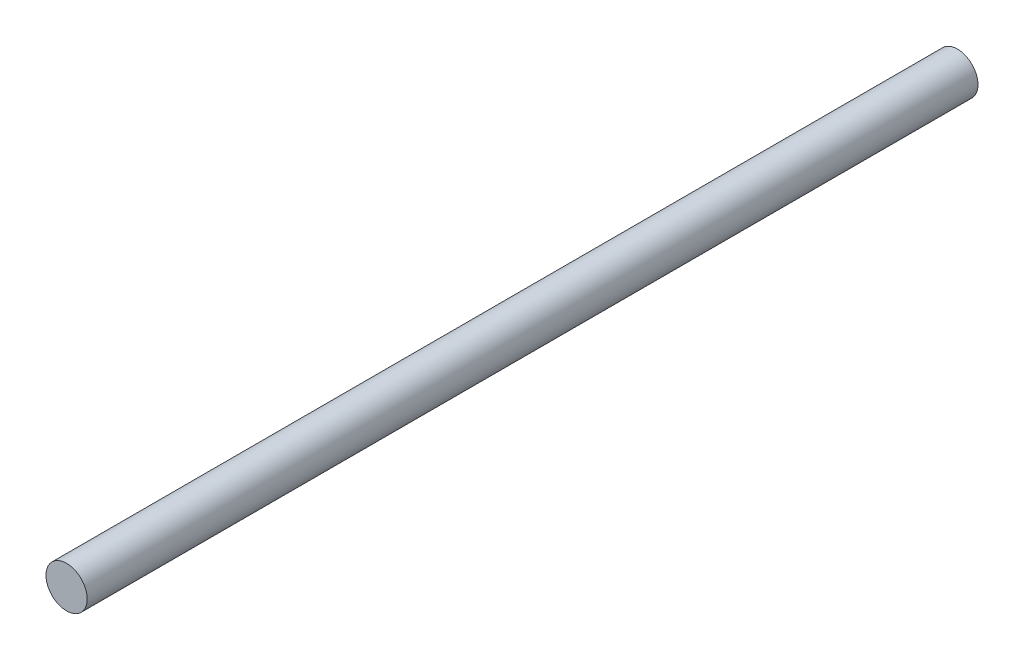
ISO-10303-21;
HEADER;
FILE_DESCRIPTION(('STEP AP214'),'2;1');
FILE_NAME('part.step','',(''),(''),'','','');
FILE_SCHEMA(('AUTOMOTIVE_DESIGN { 1 0 10303 214 1 1 1 1 }'));
ENDSEC;
DATA;
#1=APPLICATION_CONTEXT('core data for automotive mechanical design processes');
#2=APPLICATION_PROTOCOL_DEFINITION('international standard','automotive_design',2000,#1);
#3=PRODUCT_CONTEXT('',#1,'mechanical');
#4=PRODUCT('Part','Part','',(#3));
#5=PRODUCT_RELATED_PRODUCT_CATEGORY('part','',(#4));
#6=PRODUCT_DEFINITION_FORMATION('','',#4);
#7=PRODUCT_DEFINITION_CONTEXT('part definition',#1,'design');
#8=PRODUCT_DEFINITION('design','',#6,#7);
#9=PRODUCT_DEFINITION_SHAPE('','',#8);
#10=(LENGTH_UNIT() NAMED_UNIT(*) SI_UNIT(.MILLI.,.METRE.));
#11=(NAMED_UNIT(*) PLANE_ANGLE_UNIT() SI_UNIT($,.RADIAN.));
#12=(NAMED_UNIT(*) SI_UNIT($,.STERADIAN.) SOLID_ANGLE_UNIT());
#13=UNCERTAINTY_MEASURE_WITH_UNIT(LENGTH_MEASURE(1.E-05),#10,'distance_accuracy_value','');
#14=(GEOMETRIC_REPRESENTATION_CONTEXT(3) GLOBAL_UNCERTAINTY_ASSIGNED_CONTEXT((#13)) GLOBAL_UNIT_ASSIGNED_CONTEXT((#10,
#11,#12)) REPRESENTATION_CONTEXT('',''));
#15=CARTESIAN_POINT('',(0.,0.,0.));
#16=DIRECTION('',(0.,0.,1.));
#17=DIRECTION('',(1.,0.,0.));
#18=AXIS2_PLACEMENT_3D('',#15,#16,#17);
#19=CARTESIAN_POINT('',(0.,0.,205.74));
#20=DIRECTION('',(0.,0.,-1.));
#21=DIRECTION('',(-1.,0.,0.));
#22=AXIS2_PLACEMENT_3D('',#19,#20,#21);
#23=CYLINDRICAL_SURFACE('',#22,4.7625);
#24=CARTESIAN_POINT('',(0.,0.,205.74));
#25=DIRECTION('',(0.,0.,1.));
#26=DIRECTION('',(1.,0.,0.));
#27=AXIS2_PLACEMENT_3D('',#24,#25,#26);
#28=CIRCLE('',#27,4.7625);
#29=CARTESIAN_POINT('',(4.7625,0.,205.74));
#30=VERTEX_POINT('',#29);
#31=EDGE_CURVE('E10',#30,#30,#28,.T.);
#32=ORIENTED_EDGE('',*,*,#31,.F.);
#33=EDGE_LOOP('',(#32));
#34=FACE_BOUND('',#33,.T.);
#35=CARTESIAN_POINT('',(0.,0.,0.));
#36=DIRECTION('',(0.,0.,1.));
#37=DIRECTION('',(1.,0.,0.));
#38=AXIS2_PLACEMENT_3D('',#35,#36,#37);
#39=CIRCLE('',#38,4.7625);
#40=CARTESIAN_POINT('',(4.7625,0.,0.));
#41=VERTEX_POINT('',#40);
#42=EDGE_CURVE('E34',#41,#41,#39,.T.);
#43=ORIENTED_EDGE('',*,*,#42,.T.);
#44=EDGE_LOOP('',(#43));
#45=FACE_BOUND('',#44,.T.);
#46=ADVANCED_FACE('F31',(#34,#45),#23,.T.);
#47=CARTESIAN_POINT('',(0.,0.,205.74));
#48=DIRECTION('',(0.,0.,1.));
#49=DIRECTION('',(1.,0.,0.));
#50=AXIS2_PLACEMENT_3D('',#47,#48,#49);
#51=PLANE('',#50);
#52=ORIENTED_EDGE('',*,*,#31,.T.);
#53=EDGE_LOOP('',(#52));
#54=FACE_BOUND('',#53,.T.);
#55=ADVANCED_FACE('F46',(#54),#51,.T.);
#56=CARTESIAN_POINT('',(0.,0.,0.));
#57=DIRECTION('',(0.,0.,1.));
#58=DIRECTION('',(1.,0.,0.));
#59=AXIS2_PLACEMENT_3D('',#56,#57,#58);
#60=PLANE('',#59);
#61=ORIENTED_EDGE('',*,*,#42,.F.);
#62=EDGE_LOOP('',(#61));
#63=FACE_BOUND('',#62,.T.);
#64=ADVANCED_FACE('F44',(#63),#60,.F.);
#65=CLOSED_SHELL('',(#46,#55,#64));
#66=MANIFOLD_SOLID_BREP('B2',#65);
#67=ADVANCED_BREP_SHAPE_REPRESENTATION('',(#18,#66),#14);
#68=SHAPE_DEFINITION_REPRESENTATION(#9,#67);
ENDSEC;
END-ISO-10303-21;
